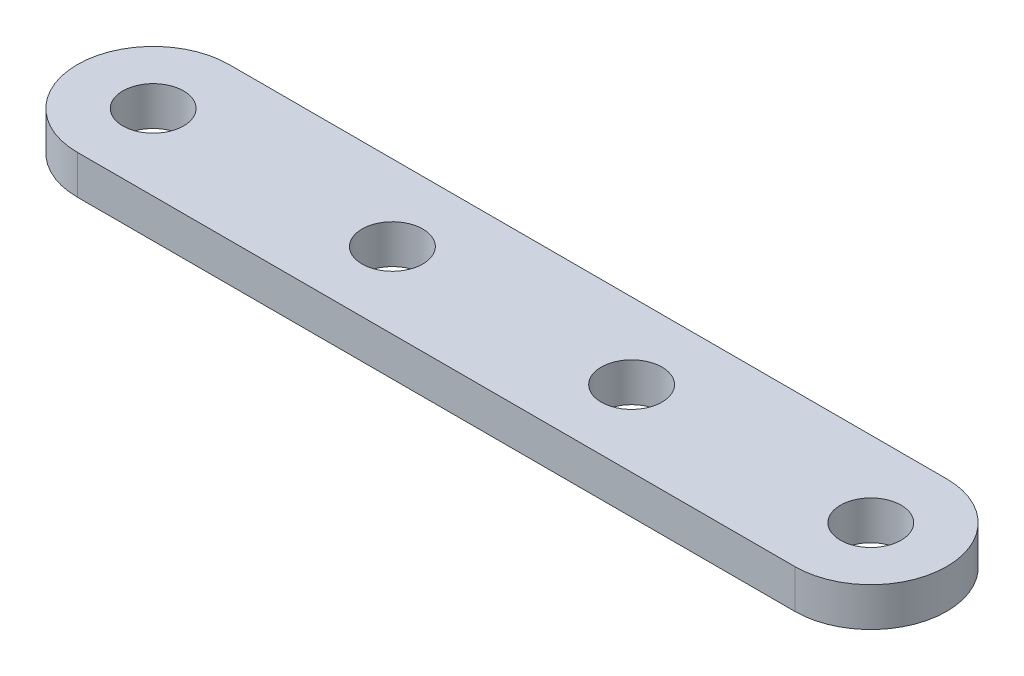
ISO-10303-21;
HEADER;
FILE_DESCRIPTION(('STEP AP214'),'2;1');
FILE_NAME('part.step','',(''),(''),'','','');
FILE_SCHEMA(('AUTOMOTIVE_DESIGN { 1 0 10303 214 1 1 1 1 }'));
ENDSEC;
DATA;
#1=APPLICATION_CONTEXT('core data for automotive mechanical design processes');
#2=APPLICATION_PROTOCOL_DEFINITION('international standard','automotive_design',2000,#1);
#3=PRODUCT_CONTEXT('',#1,'mechanical');
#4=PRODUCT('Part','Part','',(#3));
#5=PRODUCT_RELATED_PRODUCT_CATEGORY('part','',(#4));
#6=PRODUCT_DEFINITION_FORMATION('','',#4);
#7=PRODUCT_DEFINITION_CONTEXT('part definition',#1,'design');
#8=PRODUCT_DEFINITION('design','',#6,#7);
#9=PRODUCT_DEFINITION_SHAPE('','',#8);
#10=(LENGTH_UNIT() NAMED_UNIT(*) SI_UNIT(.MILLI.,.METRE.));
#11=(NAMED_UNIT(*) PLANE_ANGLE_UNIT() SI_UNIT($,.RADIAN.));
#12=(NAMED_UNIT(*) SI_UNIT($,.STERADIAN.) SOLID_ANGLE_UNIT());
#13=UNCERTAINTY_MEASURE_WITH_UNIT(LENGTH_MEASURE(1.E-05),#10,'distance_accuracy_value','');
#14=(GEOMETRIC_REPRESENTATION_CONTEXT(3) GLOBAL_UNCERTAINTY_ASSIGNED_CONTEXT((#13)) GLOBAL_UNIT_ASSIGNED_CONTEXT((#10,
#11,#12)) REPRESENTATION_CONTEXT('',''));
#15=CARTESIAN_POINT('',(0.,0.,0.));
#16=DIRECTION('',(0.,0.,1.));
#17=DIRECTION('',(1.,0.,0.));
#18=AXIS2_PLACEMENT_3D('',#15,#16,#17);
#19=CARTESIAN_POINT('',(0.,3.25,0.));
#20=DIRECTION('',(0.,1.,0.));
#21=DIRECTION('',(0.,0.,1.));
#22=AXIS2_PLACEMENT_3D('',#19,#20,#21);
#23=PLANE('',#22);
#24=CARTESIAN_POINT('',(40.,3.25,0.));
#25=DIRECTION('',(0.,1.,0.));
#26=DIRECTION('',(0.,0.,1.));
#27=AXIS2_PLACEMENT_3D('',#24,#25,#26);
#28=CIRCLE('',#27,2.54);
#29=CARTESIAN_POINT('',(40.,3.25,-2.54));
#30=VERTEX_POINT('',#29);
#31=EDGE_CURVE('E142',#30,#30,#28,.T.);
#32=ORIENTED_EDGE('',*,*,#31,.F.);
#33=EDGE_LOOP('',(#32));
#34=FACE_BOUND('',#33,.T.);
#35=CARTESIAN_POINT('',(0.,3.25,0.));
#36=DIRECTION('',(0.,1.,0.));
#37=DIRECTION('',(0.,0.,1.));
#38=AXIS2_PLACEMENT_3D('',#35,#36,#37);
#39=CIRCLE('',#38,2.54);
#40=CARTESIAN_POINT('',(0.,3.25,-2.54));
#41=VERTEX_POINT('',#40);
#42=EDGE_CURVE('E112',#41,#41,#39,.T.);
#43=ORIENTED_EDGE('',*,*,#42,.F.);
#44=EDGE_LOOP('',(#43));
#45=FACE_BOUND('',#44,.T.);
#46=CARTESIAN_POINT('',(0.,3.25,0.));
#47=DIRECTION('',(0.,1.,0.));
#48=DIRECTION('',(0.,0.,1.));
#49=AXIS2_PLACEMENT_3D('',#46,#47,#48);
#50=CIRCLE('',#49,6.35);
#51=CARTESIAN_POINT('',(0.,3.25,-6.35));
#52=VERTEX_POINT('',#51);
#53=CARTESIAN_POINT('',(0.,3.25,6.35));
#54=VERTEX_POINT('',#53);
#55=EDGE_CURVE('E92',#52,#54,#50,.T.);
#56=ORIENTED_EDGE('',*,*,#55,.T.);
#57=DIRECTION('',(1.,0.,0.));
#58=VECTOR('',#57,1.);
#59=CARTESIAN_POINT('',(0.,3.25,6.35));
#60=LINE('',#59,#58);
#61=CARTESIAN_POINT('',(60.,3.25,6.35));
#62=VERTEX_POINT('',#61);
#63=EDGE_CURVE('E87',#54,#62,#60,.T.);
#64=ORIENTED_EDGE('',*,*,#63,.T.);
#65=CARTESIAN_POINT('',(60.,3.25,0.));
#66=DIRECTION('',(0.,1.,0.));
#67=DIRECTION('',(0.,0.,1.));
#68=AXIS2_PLACEMENT_3D('',#65,#66,#67);
#69=CIRCLE('',#68,6.35);
#70=CARTESIAN_POINT('',(60.,3.25,-6.35));
#71=VERTEX_POINT('',#70);
#72=EDGE_CURVE('E90',#62,#71,#69,.T.);
#73=ORIENTED_EDGE('',*,*,#72,.T.);
#74=DIRECTION('',(-1.,0.,0.));
#75=VECTOR('',#74,1.);
#76=CARTESIAN_POINT('',(0.,3.25,-6.35));
#77=LINE('',#76,#75);
#78=EDGE_CURVE('E57',#71,#52,#77,.T.);
#79=ORIENTED_EDGE('',*,*,#78,.T.);
#80=EDGE_LOOP('',(#56,#64,#73,#79));
#81=FACE_BOUND('',#80,.T.);
#82=CARTESIAN_POINT('',(20.,3.25,0.));
#83=DIRECTION('',(0.,1.,0.));
#84=DIRECTION('',(0.,0.,1.));
#85=AXIS2_PLACEMENT_3D('',#82,#83,#84);
#86=CIRCLE('',#85,2.54);
#87=CARTESIAN_POINT('',(20.,3.25,-2.54));
#88=VERTEX_POINT('',#87);
#89=EDGE_CURVE('E134',#88,#88,#86,.T.);
#90=ORIENTED_EDGE('',*,*,#89,.F.);
#91=EDGE_LOOP('',(#90));
#92=FACE_BOUND('',#91,.T.);
#93=CARTESIAN_POINT('',(60.,3.25,0.));
#94=DIRECTION('',(0.,1.,0.));
#95=DIRECTION('',(0.,0.,1.));
#96=AXIS2_PLACEMENT_3D('',#93,#94,#95);
#97=CIRCLE('',#96,2.54);
#98=CARTESIAN_POINT('',(60.,3.25,-2.54));
#99=VERTEX_POINT('',#98);
#100=EDGE_CURVE('E150',#99,#99,#97,.T.);
#101=ORIENTED_EDGE('',*,*,#100,.F.);
#102=EDGE_LOOP('',(#101));
#103=FACE_BOUND('',#102,.T.);
#104=ADVANCED_FACE('F39',(#34,#45,#81,#92,#103),#23,.T.);
#105=CARTESIAN_POINT('',(0.,0.,0.));
#106=DIRECTION('',(0.,1.,0.));
#107=DIRECTION('',(0.,0.,1.));
#108=AXIS2_PLACEMENT_3D('',#105,#106,#107);
#109=PLANE('',#108);
#110=CARTESIAN_POINT('',(0.,0.,0.));
#111=DIRECTION('',(0.,1.,0.));
#112=DIRECTION('',(0.,0.,1.));
#113=AXIS2_PLACEMENT_3D('',#110,#111,#112);
#114=CIRCLE('',#113,6.35);
#115=CARTESIAN_POINT('',(0.,0.,-6.35));
#116=VERTEX_POINT('',#115);
#117=CARTESIAN_POINT('',(0.,0.,6.35));
#118=VERTEX_POINT('',#117);
#119=EDGE_CURVE('E108',#116,#118,#114,.T.);
#120=ORIENTED_EDGE('',*,*,#119,.F.);
#121=DIRECTION('',(-1.,0.,0.));
#122=VECTOR('',#121,1.);
#123=CARTESIAN_POINT('',(0.,0.,-6.35));
#124=LINE('',#123,#122);
#125=CARTESIAN_POINT('',(60.,0.,-6.35));
#126=VERTEX_POINT('',#125);
#127=EDGE_CURVE('E80',#126,#116,#124,.T.);
#128=ORIENTED_EDGE('',*,*,#127,.F.);
#129=CARTESIAN_POINT('',(60.,0.,0.));
#130=DIRECTION('',(0.,1.,0.));
#131=DIRECTION('',(0.,0.,1.));
#132=AXIS2_PLACEMENT_3D('',#129,#130,#131);
#133=CIRCLE('',#132,6.35);
#134=CARTESIAN_POINT('',(60.,0.,6.35));
#135=VERTEX_POINT('',#134);
#136=EDGE_CURVE('E74',#135,#126,#133,.T.);
#137=ORIENTED_EDGE('',*,*,#136,.F.);
#138=DIRECTION('',(1.,0.,0.));
#139=VECTOR('',#138,1.);
#140=CARTESIAN_POINT('',(0.,0.,6.35));
#141=LINE('',#140,#139);
#142=EDGE_CURVE('E97',#118,#135,#141,.T.);
#143=ORIENTED_EDGE('',*,*,#142,.F.);
#144=EDGE_LOOP('',(#120,#128,#137,#143));
#145=FACE_BOUND('',#144,.T.);
#146=CARTESIAN_POINT('',(0.,0.,0.));
#147=DIRECTION('',(0.,1.,0.));
#148=DIRECTION('',(0.,0.,1.));
#149=AXIS2_PLACEMENT_3D('',#146,#147,#148);
#150=CIRCLE('',#149,2.54);
#151=CARTESIAN_POINT('',(0.,0.,-2.54));
#152=VERTEX_POINT('',#151);
#153=EDGE_CURVE('E130',#152,#152,#150,.T.);
#154=ORIENTED_EDGE('',*,*,#153,.T.);
#155=EDGE_LOOP('',(#154));
#156=FACE_BOUND('',#155,.T.);
#157=CARTESIAN_POINT('',(20.,0.,0.));
#158=DIRECTION('',(0.,1.,0.));
#159=DIRECTION('',(0.,0.,1.));
#160=AXIS2_PLACEMENT_3D('',#157,#158,#159);
#161=CIRCLE('',#160,2.54);
#162=CARTESIAN_POINT('',(20.,0.,-2.54));
#163=VERTEX_POINT('',#162);
#164=EDGE_CURVE('E138',#163,#163,#161,.T.);
#165=ORIENTED_EDGE('',*,*,#164,.T.);
#166=EDGE_LOOP('',(#165));
#167=FACE_BOUND('',#166,.T.);
#168=CARTESIAN_POINT('',(40.,0.,0.));
#169=DIRECTION('',(0.,1.,0.));
#170=DIRECTION('',(0.,0.,1.));
#171=AXIS2_PLACEMENT_3D('',#168,#169,#170);
#172=CIRCLE('',#171,2.54);
#173=CARTESIAN_POINT('',(40.,0.,-2.54));
#174=VERTEX_POINT('',#173);
#175=EDGE_CURVE('E146',#174,#174,#172,.T.);
#176=ORIENTED_EDGE('',*,*,#175,.T.);
#177=EDGE_LOOP('',(#176));
#178=FACE_BOUND('',#177,.T.);
#179=CARTESIAN_POINT('',(60.,0.,0.));
#180=DIRECTION('',(0.,1.,0.));
#181=DIRECTION('',(0.,0.,1.));
#182=AXIS2_PLACEMENT_3D('',#179,#180,#181);
#183=CIRCLE('',#182,2.54);
#184=CARTESIAN_POINT('',(60.,0.,-2.54));
#185=VERTEX_POINT('',#184);
#186=EDGE_CURVE('E154',#185,#185,#183,.T.);
#187=ORIENTED_EDGE('',*,*,#186,.T.);
#188=EDGE_LOOP('',(#187));
#189=FACE_BOUND('',#188,.T.);
#190=ADVANCED_FACE('F125',(#145,#156,#167,#178,#189),#109,.F.);
#191=CARTESIAN_POINT('',(0.,3.25,0.));
#192=DIRECTION('',(0.,-1.,0.));
#193=DIRECTION('',(0.,0.,-1.));
#194=AXIS2_PLACEMENT_3D('',#191,#192,#193);
#195=CYLINDRICAL_SURFACE('',#194,6.35);
#196=ORIENTED_EDGE('',*,*,#119,.T.);
#197=DIRECTION('',(0.,-1.,0.));
#198=VECTOR('',#197,1.);
#199=CARTESIAN_POINT('',(0.,3.25,6.35));
#200=LINE('',#199,#198);
#201=EDGE_CURVE('E11',#54,#118,#200,.T.);
#202=ORIENTED_EDGE('',*,*,#201,.F.);
#203=ORIENTED_EDGE('',*,*,#55,.F.);
#204=DIRECTION('',(0.,-1.,0.));
#205=VECTOR('',#204,1.);
#206=CARTESIAN_POINT('',(0.,3.25,-6.35));
#207=LINE('',#206,#205);
#208=EDGE_CURVE('E104',#52,#116,#207,.T.);
#209=ORIENTED_EDGE('',*,*,#208,.T.);
#210=EDGE_LOOP('',(#196,#202,#203,#209));
#211=FACE_BOUND('',#210,.T.);
#212=ADVANCED_FACE('F41',(#211),#195,.T.);
#213=CARTESIAN_POINT('',(0.,3.25,6.35));
#214=DIRECTION('',(0.,0.,-1.));
#215=DIRECTION('',(-1.,0.,0.));
#216=AXIS2_PLACEMENT_3D('',#213,#214,#215);
#217=PLANE('',#216);
#218=ORIENTED_EDGE('',*,*,#142,.T.);
#219=DIRECTION('',(0.,-1.,0.));
#220=VECTOR('',#219,1.);
#221=CARTESIAN_POINT('',(60.,3.25,6.35));
#222=LINE('',#221,#220);
#223=EDGE_CURVE('E49',#62,#135,#222,.T.);
#224=ORIENTED_EDGE('',*,*,#223,.F.);
#225=ORIENTED_EDGE('',*,*,#63,.F.);
#226=ORIENTED_EDGE('',*,*,#201,.T.);
#227=EDGE_LOOP('',(#218,#224,#225,#226));
#228=FACE_BOUND('',#227,.T.);
#229=ADVANCED_FACE('F96',(#228),#217,.F.);
#230=CARTESIAN_POINT('',(60.,3.25,0.));
#231=DIRECTION('',(0.,-1.,0.));
#232=DIRECTION('',(0.,0.,-1.));
#233=AXIS2_PLACEMENT_3D('',#230,#231,#232);
#234=CYLINDRICAL_SURFACE('',#233,6.35);
#235=ORIENTED_EDGE('',*,*,#136,.T.);
#236=DIRECTION('',(0.,-1.,0.));
#237=VECTOR('',#236,1.);
#238=CARTESIAN_POINT('',(60.,3.25,-6.35));
#239=LINE('',#238,#237);
#240=EDGE_CURVE('E99',#71,#126,#239,.T.);
#241=ORIENTED_EDGE('',*,*,#240,.F.);
#242=ORIENTED_EDGE('',*,*,#72,.F.);
#243=ORIENTED_EDGE('',*,*,#223,.T.);
#244=EDGE_LOOP('',(#235,#241,#242,#243));
#245=FACE_BOUND('',#244,.T.);
#246=ADVANCED_FACE('F100',(#245),#234,.T.);
#247=CARTESIAN_POINT('',(0.,3.25,-6.35));
#248=DIRECTION('',(0.,0.,1.));
#249=DIRECTION('',(1.,0.,0.));
#250=AXIS2_PLACEMENT_3D('',#247,#248,#249);
#251=PLANE('',#250);
#252=ORIENTED_EDGE('',*,*,#127,.T.);
#253=ORIENTED_EDGE('',*,*,#208,.F.);
#254=ORIENTED_EDGE('',*,*,#78,.F.);
#255=ORIENTED_EDGE('',*,*,#240,.T.);
#256=EDGE_LOOP('',(#252,#253,#254,#255));
#257=FACE_BOUND('',#256,.T.);
#258=ADVANCED_FACE('F122',(#257),#251,.F.);
#259=CARTESIAN_POINT('',(0.,3.25,0.));
#260=DIRECTION('',(0.,-1.,0.));
#261=DIRECTION('',(0.,0.,-1.));
#262=AXIS2_PLACEMENT_3D('',#259,#260,#261);
#263=CYLINDRICAL_SURFACE('',#262,2.54);
#264=CARTESIAN_POINT('',(0.,3.25,-2.54));
#265=CARTESIAN_POINT('',(0.,3.21614583333333,-2.54));
#266=CARTESIAN_POINT('',(0.,3.18229166666667,-2.54));
#267=CARTESIAN_POINT('',(0.,3.11458333333333,-2.54));
#268=CARTESIAN_POINT('',(0.,3.08072916666667,-2.54));
#269=CARTESIAN_POINT('',(0.,3.01302083333333,-2.54));
#270=CARTESIAN_POINT('',(0.,2.97916666666667,-2.54));
#271=CARTESIAN_POINT('',(0.,2.91145833333333,-2.54));
#272=CARTESIAN_POINT('',(0.,2.87760416666667,-2.54));
#273=CARTESIAN_POINT('',(0.,2.80989583333333,-2.54));
#274=CARTESIAN_POINT('',(0.,2.77604166666667,-2.54));
#275=CARTESIAN_POINT('',(0.,2.70833333333333,-2.54));
#276=CARTESIAN_POINT('',(0.,2.67447916666667,-2.54));
#277=CARTESIAN_POINT('',(0.,2.60677083333333,-2.54));
#278=CARTESIAN_POINT('',(0.,2.57291666666667,-2.54));
#279=CARTESIAN_POINT('',(0.,2.50520833333333,-2.54));
#280=CARTESIAN_POINT('',(0.,2.47135416666667,-2.54));
#281=CARTESIAN_POINT('',(0.,2.40364583333333,-2.54));
#282=CARTESIAN_POINT('',(0.,2.36979166666667,-2.54));
#283=CARTESIAN_POINT('',(0.,2.30208333333333,-2.54));
#284=CARTESIAN_POINT('',(0.,2.26822916666667,-2.54));
#285=CARTESIAN_POINT('',(0.,2.20052083333333,-2.54));
#286=CARTESIAN_POINT('',(0.,2.16666666666667,-2.54));
#287=CARTESIAN_POINT('',(0.,2.09895833333333,-2.54));
#288=CARTESIAN_POINT('',(0.,2.06510416666667,-2.54));
#289=CARTESIAN_POINT('',(0.,1.99739583333333,-2.54));
#290=CARTESIAN_POINT('',(0.,1.96354166666667,-2.54));
#291=CARTESIAN_POINT('',(0.,1.89583333333333,-2.54));
#292=CARTESIAN_POINT('',(0.,1.86197916666667,-2.54));
#293=CARTESIAN_POINT('',(0.,1.79427083333333,-2.54));
#294=CARTESIAN_POINT('',(0.,1.76041666666667,-2.54));
#295=CARTESIAN_POINT('',(0.,1.69270833333333,-2.54));
#296=CARTESIAN_POINT('',(0.,1.65885416666667,-2.54));
#297=CARTESIAN_POINT('',(0.,1.59114583333333,-2.54));
#298=CARTESIAN_POINT('',(0.,1.55729166666667,-2.54));
#299=CARTESIAN_POINT('',(0.,1.48958333333333,-2.54));
#300=CARTESIAN_POINT('',(0.,1.45572916666667,-2.54));
#301=CARTESIAN_POINT('',(0.,1.38802083333333,-2.54));
#302=CARTESIAN_POINT('',(0.,1.35416666666667,-2.54));
#303=CARTESIAN_POINT('',(0.,1.28645833333333,-2.54));
#304=CARTESIAN_POINT('',(0.,1.25260416666667,-2.54));
#305=CARTESIAN_POINT('',(0.,1.18489583333333,-2.54));
#306=CARTESIAN_POINT('',(0.,1.15104166666667,-2.54));
#307=CARTESIAN_POINT('',(0.,1.08333333333333,-2.54));
#308=CARTESIAN_POINT('',(0.,1.04947916666667,-2.54));
#309=CARTESIAN_POINT('',(0.,0.981770833333333,-2.54));
#310=CARTESIAN_POINT('',(0.,0.947916666666667,-2.54));
#311=CARTESIAN_POINT('',(0.,0.880208333333333,-2.54));
#312=CARTESIAN_POINT('',(0.,0.846354166666667,-2.54));
#313=CARTESIAN_POINT('',(0.,0.778645833333333,-2.54));
#314=CARTESIAN_POINT('',(0.,0.744791666666667,-2.54));
#315=CARTESIAN_POINT('',(0.,0.677083333333333,-2.54));
#316=CARTESIAN_POINT('',(0.,0.643229166666667,-2.54));
#317=CARTESIAN_POINT('',(0.,0.575520833333333,-2.54));
#318=CARTESIAN_POINT('',(0.,0.541666666666667,-2.54));
#319=CARTESIAN_POINT('',(0.,0.473958333333333,-2.54));
#320=CARTESIAN_POINT('',(0.,0.440104166666667,-2.54));
#321=CARTESIAN_POINT('',(0.,0.372395833333333,-2.54));
#322=CARTESIAN_POINT('',(0.,0.338541666666667,-2.54));
#323=CARTESIAN_POINT('',(0.,0.270833333333333,-2.54));
#324=CARTESIAN_POINT('',(0.,0.236979166666667,-2.54));
#325=CARTESIAN_POINT('',(0.,0.169270833333333,-2.54));
#326=CARTESIAN_POINT('',(0.,0.135416666666667,-2.54));
#327=CARTESIAN_POINT('',(0.,0.0677083333333334,-2.54));
#328=CARTESIAN_POINT('',(0.,0.0338541666666667,-2.54));
#329=CARTESIAN_POINT('',(0.,0.,-2.54));
#330=B_SPLINE_CURVE_WITH_KNOTS('',3,(#264,#265,#266,#267,#268,#269,#270,#271,#272,#273,#274,
#275,#276,#277,#278,#279,#280,#281,#282,#283,#284,#285,#286,#287,#288,#289,#290,#291,#292,#293,
#294,#295,#296,#297,#298,#299,#300,#301,#302,#303,#304,#305,#306,#307,#308,#309,#310,#311,#312,
#313,#314,#315,#316,#317,#318,#319,#320,#321,#322,#323,#324,#325,#326,#327,#328,#329),
.UNSPECIFIED.,.F.,.F.,(4,2,2,2,2,2,2,2,2,2,2,2,2,2,2,2,2,2,2,2,2,2,2,2,2,2,2,2,2,2,2,2,4),(0.,
0.1015625,0.203125,0.3046875,0.40625,0.5078125,0.609375,0.7109375,0.8125,0.9140625,1.015625,
1.1171875,1.21875,1.3203125,1.421875,1.5234375,1.625,1.7265625,1.828125,1.9296875,2.03125,
2.1328125,2.234375,2.3359375,2.4375,2.5390625,2.640625,2.7421875,2.84375,2.9453125,3.046875,
3.1484375,3.25),.UNSPECIFIED.);
#331=EDGE_CURVE('BSEAM175',#41,#152,#330,.T.);
#332=ORIENTED_EDGE('',*,*,#42,.T.);
#333=ORIENTED_EDGE('',*,*,#153,.F.);
#334=ORIENTED_EDGE('',*,*,#331,.T.);
#335=ORIENTED_EDGE('',*,*,#331,.F.);
#336=EDGE_LOOP('',(#332,#334,#333,#335));
#337=FACE_BOUND('',#336,.T.);
#338=ADVANCED_FACE('F175',(#337),#263,.F.);
#339=CARTESIAN_POINT('',(20.,3.25,0.));
#340=DIRECTION('',(0.,-1.,0.));
#341=DIRECTION('',(0.,0.,-1.));
#342=AXIS2_PLACEMENT_3D('',#339,#340,#341);
#343=CYLINDRICAL_SURFACE('',#342,2.54);
#344=CARTESIAN_POINT('',(20.,3.25,-2.54));
#345=CARTESIAN_POINT('',(20.,3.21614583333333,-2.54));
#346=CARTESIAN_POINT('',(20.,3.18229166666667,-2.54));
#347=CARTESIAN_POINT('',(20.,3.11458333333333,-2.54));
#348=CARTESIAN_POINT('',(20.,3.08072916666667,-2.54));
#349=CARTESIAN_POINT('',(20.,3.01302083333333,-2.54));
#350=CARTESIAN_POINT('',(20.,2.97916666666667,-2.54));
#351=CARTESIAN_POINT('',(20.,2.91145833333333,-2.54));
#352=CARTESIAN_POINT('',(20.,2.87760416666667,-2.54));
#353=CARTESIAN_POINT('',(20.,2.80989583333333,-2.54));
#354=CARTESIAN_POINT('',(20.,2.77604166666667,-2.54));
#355=CARTESIAN_POINT('',(20.,2.70833333333333,-2.54));
#356=CARTESIAN_POINT('',(20.,2.67447916666667,-2.54));
#357=CARTESIAN_POINT('',(20.,2.60677083333333,-2.54));
#358=CARTESIAN_POINT('',(20.,2.57291666666667,-2.54));
#359=CARTESIAN_POINT('',(20.,2.50520833333333,-2.54));
#360=CARTESIAN_POINT('',(20.,2.47135416666667,-2.54));
#361=CARTESIAN_POINT('',(20.,2.40364583333333,-2.54));
#362=CARTESIAN_POINT('',(20.,2.36979166666667,-2.54));
#363=CARTESIAN_POINT('',(20.,2.30208333333333,-2.54));
#364=CARTESIAN_POINT('',(20.,2.26822916666667,-2.54));
#365=CARTESIAN_POINT('',(20.,2.20052083333333,-2.54));
#366=CARTESIAN_POINT('',(20.,2.16666666666667,-2.54));
#367=CARTESIAN_POINT('',(20.,2.09895833333333,-2.54));
#368=CARTESIAN_POINT('',(20.,2.06510416666667,-2.54));
#369=CARTESIAN_POINT('',(20.,1.99739583333333,-2.54));
#370=CARTESIAN_POINT('',(20.,1.96354166666667,-2.54));
#371=CARTESIAN_POINT('',(20.,1.89583333333333,-2.54));
#372=CARTESIAN_POINT('',(20.,1.86197916666667,-2.54));
#373=CARTESIAN_POINT('',(20.,1.79427083333333,-2.54));
#374=CARTESIAN_POINT('',(20.,1.76041666666667,-2.54));
#375=CARTESIAN_POINT('',(20.,1.69270833333333,-2.54));
#376=CARTESIAN_POINT('',(20.,1.65885416666667,-2.54));
#377=CARTESIAN_POINT('',(20.,1.59114583333333,-2.54));
#378=CARTESIAN_POINT('',(20.,1.55729166666667,-2.54));
#379=CARTESIAN_POINT('',(20.,1.48958333333333,-2.54));
#380=CARTESIAN_POINT('',(20.,1.45572916666667,-2.54));
#381=CARTESIAN_POINT('',(20.,1.38802083333333,-2.54));
#382=CARTESIAN_POINT('',(20.,1.35416666666667,-2.54));
#383=CARTESIAN_POINT('',(20.,1.28645833333333,-2.54));
#384=CARTESIAN_POINT('',(20.,1.25260416666667,-2.54));
#385=CARTESIAN_POINT('',(20.,1.18489583333333,-2.54));
#386=CARTESIAN_POINT('',(20.,1.15104166666667,-2.54));
#387=CARTESIAN_POINT('',(20.,1.08333333333333,-2.54));
#388=CARTESIAN_POINT('',(20.,1.04947916666667,-2.54));
#389=CARTESIAN_POINT('',(20.,0.981770833333333,-2.54));
#390=CARTESIAN_POINT('',(20.,0.947916666666667,-2.54));
#391=CARTESIAN_POINT('',(20.,0.880208333333333,-2.54));
#392=CARTESIAN_POINT('',(20.,0.846354166666667,-2.54));
#393=CARTESIAN_POINT('',(20.,0.778645833333333,-2.54));
#394=CARTESIAN_POINT('',(20.,0.744791666666667,-2.54));
#395=CARTESIAN_POINT('',(20.,0.677083333333333,-2.54));
#396=CARTESIAN_POINT('',(20.,0.643229166666667,-2.54));
#397=CARTESIAN_POINT('',(20.,0.575520833333333,-2.54));
#398=CARTESIAN_POINT('',(20.,0.541666666666667,-2.54));
#399=CARTESIAN_POINT('',(20.,0.473958333333333,-2.54));
#400=CARTESIAN_POINT('',(20.,0.440104166666667,-2.54));
#401=CARTESIAN_POINT('',(20.,0.372395833333333,-2.54));
#402=CARTESIAN_POINT('',(20.,0.338541666666667,-2.54));
#403=CARTESIAN_POINT('',(20.,0.270833333333333,-2.54));
#404=CARTESIAN_POINT('',(20.,0.236979166666667,-2.54));
#405=CARTESIAN_POINT('',(20.,0.169270833333333,-2.54));
#406=CARTESIAN_POINT('',(20.,0.135416666666667,-2.54));
#407=CARTESIAN_POINT('',(20.,0.0677083333333334,-2.54));
#408=CARTESIAN_POINT('',(20.,0.0338541666666667,-2.54));
#409=CARTESIAN_POINT('',(20.,0.,-2.54));
#410=B_SPLINE_CURVE_WITH_KNOTS('',3,(#344,#345,#346,#347,#348,#349,#350,#351,#352,#353,#354,
#355,#356,#357,#358,#359,#360,#361,#362,#363,#364,#365,#366,#367,#368,#369,#370,#371,#372,#373,
#374,#375,#376,#377,#378,#379,#380,#381,#382,#383,#384,#385,#386,#387,#388,#389,#390,#391,#392,
#393,#394,#395,#396,#397,#398,#399,#400,#401,#402,#403,#404,#405,#406,#407,#408,#409),
.UNSPECIFIED.,.F.,.F.,(4,2,2,2,2,2,2,2,2,2,2,2,2,2,2,2,2,2,2,2,2,2,2,2,2,2,2,2,2,2,2,2,4),(0.,
0.1015625,0.203125,0.3046875,0.40625,0.5078125,0.609375,0.7109375,0.8125,0.9140625,1.015625,
1.1171875,1.21875,1.3203125,1.421875,1.5234375,1.625,1.7265625,1.828125,1.9296875,2.03125,
2.1328125,2.234375,2.3359375,2.4375,2.5390625,2.640625,2.7421875,2.84375,2.9453125,3.046875,
3.1484375,3.25),.UNSPECIFIED.);
#411=EDGE_CURVE('BSEAM221',#88,#163,#410,.T.);
#412=ORIENTED_EDGE('',*,*,#89,.T.);
#413=ORIENTED_EDGE('',*,*,#164,.F.);
#414=ORIENTED_EDGE('',*,*,#411,.T.);
#415=ORIENTED_EDGE('',*,*,#411,.F.);
#416=EDGE_LOOP('',(#412,#414,#413,#415));
#417=FACE_BOUND('',#416,.T.);
#418=ADVANCED_FACE('F221',(#417),#343,.F.);
#419=CARTESIAN_POINT('',(40.,3.25,0.));
#420=DIRECTION('',(0.,-1.,0.));
#421=DIRECTION('',(0.,0.,-1.));
#422=AXIS2_PLACEMENT_3D('',#419,#420,#421);
#423=CYLINDRICAL_SURFACE('',#422,2.54);
#424=CARTESIAN_POINT('',(40.,3.25,-2.54));
#425=CARTESIAN_POINT('',(40.,3.21614583333333,-2.54));
#426=CARTESIAN_POINT('',(40.,3.18229166666667,-2.54));
#427=CARTESIAN_POINT('',(40.,3.11458333333333,-2.54));
#428=CARTESIAN_POINT('',(40.,3.08072916666667,-2.54));
#429=CARTESIAN_POINT('',(40.,3.01302083333333,-2.54));
#430=CARTESIAN_POINT('',(40.,2.97916666666667,-2.54));
#431=CARTESIAN_POINT('',(40.,2.91145833333333,-2.54));
#432=CARTESIAN_POINT('',(40.,2.87760416666667,-2.54));
#433=CARTESIAN_POINT('',(40.,2.80989583333333,-2.54));
#434=CARTESIAN_POINT('',(40.,2.77604166666667,-2.54));
#435=CARTESIAN_POINT('',(40.,2.70833333333333,-2.54));
#436=CARTESIAN_POINT('',(40.,2.67447916666667,-2.54));
#437=CARTESIAN_POINT('',(40.,2.60677083333333,-2.54));
#438=CARTESIAN_POINT('',(40.,2.57291666666667,-2.54));
#439=CARTESIAN_POINT('',(40.,2.50520833333333,-2.54));
#440=CARTESIAN_POINT('',(40.,2.47135416666667,-2.54));
#441=CARTESIAN_POINT('',(40.,2.40364583333333,-2.54));
#442=CARTESIAN_POINT('',(40.,2.36979166666667,-2.54));
#443=CARTESIAN_POINT('',(40.,2.30208333333333,-2.54));
#444=CARTESIAN_POINT('',(40.,2.26822916666667,-2.54));
#445=CARTESIAN_POINT('',(40.,2.20052083333333,-2.54));
#446=CARTESIAN_POINT('',(40.,2.16666666666667,-2.54));
#447=CARTESIAN_POINT('',(40.,2.09895833333333,-2.54));
#448=CARTESIAN_POINT('',(40.,2.06510416666667,-2.54));
#449=CARTESIAN_POINT('',(40.,1.99739583333333,-2.54));
#450=CARTESIAN_POINT('',(40.,1.96354166666667,-2.54));
#451=CARTESIAN_POINT('',(40.,1.89583333333333,-2.54));
#452=CARTESIAN_POINT('',(40.,1.86197916666667,-2.54));
#453=CARTESIAN_POINT('',(40.,1.79427083333333,-2.54));
#454=CARTESIAN_POINT('',(40.,1.76041666666667,-2.54));
#455=CARTESIAN_POINT('',(40.,1.69270833333333,-2.54));
#456=CARTESIAN_POINT('',(40.,1.65885416666667,-2.54));
#457=CARTESIAN_POINT('',(40.,1.59114583333333,-2.54));
#458=CARTESIAN_POINT('',(40.,1.55729166666667,-2.54));
#459=CARTESIAN_POINT('',(40.,1.48958333333333,-2.54));
#460=CARTESIAN_POINT('',(40.,1.45572916666667,-2.54));
#461=CARTESIAN_POINT('',(40.,1.38802083333333,-2.54));
#462=CARTESIAN_POINT('',(40.,1.35416666666667,-2.54));
#463=CARTESIAN_POINT('',(40.,1.28645833333333,-2.54));
#464=CARTESIAN_POINT('',(40.,1.25260416666667,-2.54));
#465=CARTESIAN_POINT('',(40.,1.18489583333333,-2.54));
#466=CARTESIAN_POINT('',(40.,1.15104166666667,-2.54));
#467=CARTESIAN_POINT('',(40.,1.08333333333333,-2.54));
#468=CARTESIAN_POINT('',(40.,1.04947916666667,-2.54));
#469=CARTESIAN_POINT('',(40.,0.981770833333333,-2.54));
#470=CARTESIAN_POINT('',(40.,0.947916666666667,-2.54));
#471=CARTESIAN_POINT('',(40.,0.880208333333333,-2.54));
#472=CARTESIAN_POINT('',(40.,0.846354166666667,-2.54));
#473=CARTESIAN_POINT('',(40.,0.778645833333333,-2.54));
#474=CARTESIAN_POINT('',(40.,0.744791666666667,-2.54));
#475=CARTESIAN_POINT('',(40.,0.677083333333333,-2.54));
#476=CARTESIAN_POINT('',(40.,0.643229166666667,-2.54));
#477=CARTESIAN_POINT('',(40.,0.575520833333333,-2.54));
#478=CARTESIAN_POINT('',(40.,0.541666666666667,-2.54));
#479=CARTESIAN_POINT('',(40.,0.473958333333333,-2.54));
#480=CARTESIAN_POINT('',(40.,0.440104166666667,-2.54));
#481=CARTESIAN_POINT('',(40.,0.372395833333333,-2.54));
#482=CARTESIAN_POINT('',(40.,0.338541666666667,-2.54));
#483=CARTESIAN_POINT('',(40.,0.270833333333333,-2.54));
#484=CARTESIAN_POINT('',(40.,0.236979166666667,-2.54));
#485=CARTESIAN_POINT('',(40.,0.169270833333333,-2.54));
#486=CARTESIAN_POINT('',(40.,0.135416666666667,-2.54));
#487=CARTESIAN_POINT('',(40.,0.0677083333333334,-2.54));
#488=CARTESIAN_POINT('',(40.,0.0338541666666667,-2.54));
#489=CARTESIAN_POINT('',(40.,0.,-2.54));
#490=B_SPLINE_CURVE_WITH_KNOTS('',3,(#424,#425,#426,#427,#428,#429,#430,#431,#432,#433,#434,
#435,#436,#437,#438,#439,#440,#441,#442,#443,#444,#445,#446,#447,#448,#449,#450,#451,#452,#453,
#454,#455,#456,#457,#458,#459,#460,#461,#462,#463,#464,#465,#466,#467,#468,#469,#470,#471,#472,
#473,#474,#475,#476,#477,#478,#479,#480,#481,#482,#483,#484,#485,#486,#487,#488,#489),
.UNSPECIFIED.,.F.,.F.,(4,2,2,2,2,2,2,2,2,2,2,2,2,2,2,2,2,2,2,2,2,2,2,2,2,2,2,2,2,2,2,2,4),(0.,
0.1015625,0.203125,0.3046875,0.40625,0.5078125,0.609375,0.7109375,0.8125,0.9140625,1.015625,
1.1171875,1.21875,1.3203125,1.421875,1.5234375,1.625,1.7265625,1.828125,1.9296875,2.03125,
2.1328125,2.234375,2.3359375,2.4375,2.5390625,2.640625,2.7421875,2.84375,2.9453125,3.046875,
3.1484375,3.25),.UNSPECIFIED.);
#491=EDGE_CURVE('BSEAM229',#30,#174,#490,.T.);
#492=ORIENTED_EDGE('',*,*,#31,.T.);
#493=ORIENTED_EDGE('',*,*,#175,.F.);
#494=ORIENTED_EDGE('',*,*,#491,.T.);
#495=ORIENTED_EDGE('',*,*,#491,.F.);
#496=EDGE_LOOP('',(#492,#494,#493,#495));
#497=FACE_BOUND('',#496,.T.);
#498=ADVANCED_FACE('F229',(#497),#423,.F.);
#499=CARTESIAN_POINT('',(60.,3.25,0.));
#500=DIRECTION('',(0.,-1.,0.));
#501=DIRECTION('',(0.,0.,-1.));
#502=AXIS2_PLACEMENT_3D('',#499,#500,#501);
#503=CYLINDRICAL_SURFACE('',#502,2.54);
#504=CARTESIAN_POINT('',(60.,3.25,-2.54));
#505=CARTESIAN_POINT('',(60.,3.21614583333333,-2.54));
#506=CARTESIAN_POINT('',(60.,3.18229166666667,-2.54));
#507=CARTESIAN_POINT('',(60.,3.11458333333333,-2.54));
#508=CARTESIAN_POINT('',(60.,3.08072916666667,-2.54));
#509=CARTESIAN_POINT('',(60.,3.01302083333333,-2.54));
#510=CARTESIAN_POINT('',(60.,2.97916666666667,-2.54));
#511=CARTESIAN_POINT('',(60.,2.91145833333333,-2.54));
#512=CARTESIAN_POINT('',(60.,2.87760416666667,-2.54));
#513=CARTESIAN_POINT('',(60.,2.80989583333333,-2.54));
#514=CARTESIAN_POINT('',(60.,2.77604166666667,-2.54));
#515=CARTESIAN_POINT('',(60.,2.70833333333333,-2.54));
#516=CARTESIAN_POINT('',(60.,2.67447916666667,-2.54));
#517=CARTESIAN_POINT('',(60.,2.60677083333333,-2.54));
#518=CARTESIAN_POINT('',(60.,2.57291666666667,-2.54));
#519=CARTESIAN_POINT('',(60.,2.50520833333333,-2.54));
#520=CARTESIAN_POINT('',(60.,2.47135416666667,-2.54));
#521=CARTESIAN_POINT('',(60.,2.40364583333333,-2.54));
#522=CARTESIAN_POINT('',(60.,2.36979166666667,-2.54));
#523=CARTESIAN_POINT('',(60.,2.30208333333333,-2.54));
#524=CARTESIAN_POINT('',(60.,2.26822916666667,-2.54));
#525=CARTESIAN_POINT('',(60.,2.20052083333333,-2.54));
#526=CARTESIAN_POINT('',(60.,2.16666666666667,-2.54));
#527=CARTESIAN_POINT('',(60.,2.09895833333333,-2.54));
#528=CARTESIAN_POINT('',(60.,2.06510416666667,-2.54));
#529=CARTESIAN_POINT('',(60.,1.99739583333333,-2.54));
#530=CARTESIAN_POINT('',(60.,1.96354166666667,-2.54));
#531=CARTESIAN_POINT('',(60.,1.89583333333333,-2.54));
#532=CARTESIAN_POINT('',(60.,1.86197916666667,-2.54));
#533=CARTESIAN_POINT('',(60.,1.79427083333333,-2.54));
#534=CARTESIAN_POINT('',(60.,1.76041666666667,-2.54));
#535=CARTESIAN_POINT('',(60.,1.69270833333333,-2.54));
#536=CARTESIAN_POINT('',(60.,1.65885416666667,-2.54));
#537=CARTESIAN_POINT('',(60.,1.59114583333333,-2.54));
#538=CARTESIAN_POINT('',(60.,1.55729166666667,-2.54));
#539=CARTESIAN_POINT('',(60.,1.48958333333333,-2.54));
#540=CARTESIAN_POINT('',(60.,1.45572916666667,-2.54));
#541=CARTESIAN_POINT('',(60.,1.38802083333333,-2.54));
#542=CARTESIAN_POINT('',(60.,1.35416666666667,-2.54));
#543=CARTESIAN_POINT('',(60.,1.28645833333333,-2.54));
#544=CARTESIAN_POINT('',(60.,1.25260416666667,-2.54));
#545=CARTESIAN_POINT('',(60.,1.18489583333333,-2.54));
#546=CARTESIAN_POINT('',(60.,1.15104166666667,-2.54));
#547=CARTESIAN_POINT('',(60.,1.08333333333333,-2.54));
#548=CARTESIAN_POINT('',(60.,1.04947916666667,-2.54));
#549=CARTESIAN_POINT('',(60.,0.981770833333333,-2.54));
#550=CARTESIAN_POINT('',(60.,0.947916666666667,-2.54));
#551=CARTESIAN_POINT('',(60.,0.880208333333333,-2.54));
#552=CARTESIAN_POINT('',(60.,0.846354166666667,-2.54));
#553=CARTESIAN_POINT('',(60.,0.778645833333333,-2.54));
#554=CARTESIAN_POINT('',(60.,0.744791666666667,-2.54));
#555=CARTESIAN_POINT('',(60.,0.677083333333333,-2.54));
#556=CARTESIAN_POINT('',(60.,0.643229166666667,-2.54));
#557=CARTESIAN_POINT('',(60.,0.575520833333333,-2.54));
#558=CARTESIAN_POINT('',(60.,0.541666666666667,-2.54));
#559=CARTESIAN_POINT('',(60.,0.473958333333333,-2.54));
#560=CARTESIAN_POINT('',(60.,0.440104166666667,-2.54));
#561=CARTESIAN_POINT('',(60.,0.372395833333333,-2.54));
#562=CARTESIAN_POINT('',(60.,0.338541666666667,-2.54));
#563=CARTESIAN_POINT('',(60.,0.270833333333333,-2.54));
#564=CARTESIAN_POINT('',(60.,0.236979166666667,-2.54));
#565=CARTESIAN_POINT('',(60.,0.169270833333333,-2.54));
#566=CARTESIAN_POINT('',(60.,0.135416666666667,-2.54));
#567=CARTESIAN_POINT('',(60.,0.0677083333333334,-2.54));
#568=CARTESIAN_POINT('',(60.,0.0338541666666667,-2.54));
#569=CARTESIAN_POINT('',(60.,0.,-2.54));
#570=B_SPLINE_CURVE_WITH_KNOTS('',3,(#504,#505,#506,#507,#508,#509,#510,#511,#512,#513,#514,
#515,#516,#517,#518,#519,#520,#521,#522,#523,#524,#525,#526,#527,#528,#529,#530,#531,#532,#533,
#534,#535,#536,#537,#538,#539,#540,#541,#542,#543,#544,#545,#546,#547,#548,#549,#550,#551,#552,
#553,#554,#555,#556,#557,#558,#559,#560,#561,#562,#563,#564,#565,#566,#567,#568,#569),
.UNSPECIFIED.,.F.,.F.,(4,2,2,2,2,2,2,2,2,2,2,2,2,2,2,2,2,2,2,2,2,2,2,2,2,2,2,2,2,2,2,2,4),(0.,
0.1015625,0.203125,0.3046875,0.40625,0.5078125,0.609375,0.7109375,0.8125,0.9140625,1.015625,
1.1171875,1.21875,1.3203125,1.421875,1.5234375,1.625,1.7265625,1.828125,1.9296875,2.03125,
2.1328125,2.234375,2.3359375,2.4375,2.5390625,2.640625,2.7421875,2.84375,2.9453125,3.046875,
3.1484375,3.25),.UNSPECIFIED.);
#571=EDGE_CURVE('BSEAM162',#99,#185,#570,.T.);
#572=ORIENTED_EDGE('',*,*,#100,.T.);
#573=ORIENTED_EDGE('',*,*,#186,.F.);
#574=ORIENTED_EDGE('',*,*,#571,.T.);
#575=ORIENTED_EDGE('',*,*,#571,.F.);
#576=EDGE_LOOP('',(#572,#574,#573,#575));
#577=FACE_BOUND('',#576,.T.);
#578=ADVANCED_FACE('F162',(#577),#503,.F.);
#579=CLOSED_SHELL('',(#104,#190,#212,#229,#246,#258,#338,#418,#498,#578));
#580=MANIFOLD_SOLID_BREP('B2',#579);
#581=ADVANCED_BREP_SHAPE_REPRESENTATION('',(#18,#580),#14);
#582=SHAPE_DEFINITION_REPRESENTATION(#9,#581);
ENDSEC;
END-ISO-10303-21;
